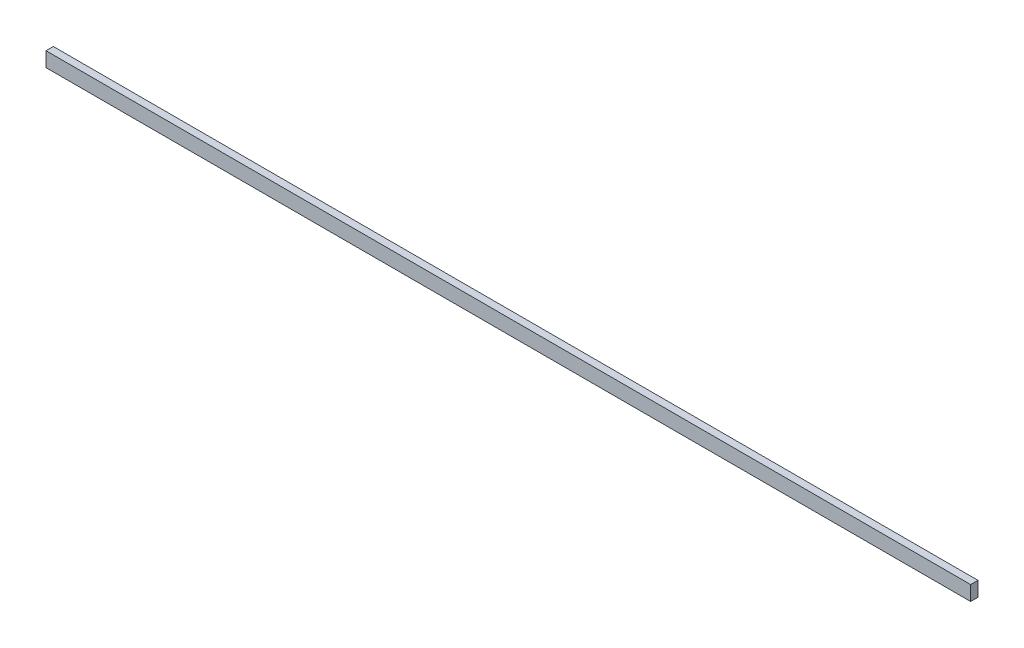
ISO-10303-21;
HEADER;
FILE_DESCRIPTION(('STEP AP214'),'2;1');
FILE_NAME('part.step','',(''),(''),'','','');
FILE_SCHEMA(('AUTOMOTIVE_DESIGN { 1 0 10303 214 1 1 1 1 }'));
ENDSEC;
DATA;
#1=APPLICATION_CONTEXT('core data for automotive mechanical design processes');
#2=APPLICATION_PROTOCOL_DEFINITION('international standard','automotive_design',2000,#1);
#3=PRODUCT_CONTEXT('',#1,'mechanical');
#4=PRODUCT('Part','Part','',(#3));
#5=PRODUCT_RELATED_PRODUCT_CATEGORY('part','',(#4));
#6=PRODUCT_DEFINITION_FORMATION('','',#4);
#7=PRODUCT_DEFINITION_CONTEXT('part definition',#1,'design');
#8=PRODUCT_DEFINITION('design','',#6,#7);
#9=PRODUCT_DEFINITION_SHAPE('','',#8);
#10=(LENGTH_UNIT() NAMED_UNIT(*) SI_UNIT(.MILLI.,.METRE.));
#11=(NAMED_UNIT(*) PLANE_ANGLE_UNIT() SI_UNIT($,.RADIAN.));
#12=(NAMED_UNIT(*) SI_UNIT($,.STERADIAN.) SOLID_ANGLE_UNIT());
#13=UNCERTAINTY_MEASURE_WITH_UNIT(LENGTH_MEASURE(1.E-05),#10,'distance_accuracy_value','');
#14=(GEOMETRIC_REPRESENTATION_CONTEXT(3) GLOBAL_UNCERTAINTY_ASSIGNED_CONTEXT((#13)) GLOBAL_UNIT_ASSIGNED_CONTEXT((#10,
#11,#12)) REPRESENTATION_CONTEXT('',''));
#15=CARTESIAN_POINT('',(0.,0.,0.));
#16=DIRECTION('',(0.,0.,1.));
#17=DIRECTION('',(1.,0.,0.));
#18=AXIS2_PLACEMENT_3D('',#15,#16,#17);
#19=CARTESIAN_POINT('',(0.,10.,0.));
#20=DIRECTION('',(1.,0.,0.));
#21=DIRECTION('',(0.,0.,-1.));
#22=AXIS2_PLACEMENT_3D('',#19,#20,#21);
#23=PLANE('',#22);
#24=DIRECTION('',(0.,0.,1.));
#25=VECTOR('',#24,1.);
#26=CARTESIAN_POINT('',(0.,0.,0.));
#27=LINE('',#26,#25);
#28=CARTESIAN_POINT('',(0.,0.,0.));
#29=VERTEX_POINT('',#28);
#30=CARTESIAN_POINT('',(0.,0.,5.));
#31=VERTEX_POINT('',#30);
#32=EDGE_CURVE('E96',#29,#31,#27,.T.);
#33=ORIENTED_EDGE('',*,*,#32,.T.);
#34=DIRECTION('',(0.,-1.,0.));
#35=VECTOR('',#34,1.);
#36=CARTESIAN_POINT('',(0.,10.,5.));
#37=LINE('',#36,#35);
#38=CARTESIAN_POINT('',(0.,10.,5.));
#39=VERTEX_POINT('',#38);
#40=EDGE_CURVE('E11',#39,#31,#37,.T.);
#41=ORIENTED_EDGE('',*,*,#40,.F.);
#42=DIRECTION('',(0.,0.,1.));
#43=VECTOR('',#42,1.);
#44=CARTESIAN_POINT('',(0.,10.,0.));
#45=LINE('',#44,#43);
#46=CARTESIAN_POINT('',(0.,10.,0.));
#47=VERTEX_POINT('',#46);
#48=EDGE_CURVE('E84',#47,#39,#45,.T.);
#49=ORIENTED_EDGE('',*,*,#48,.F.);
#50=DIRECTION('',(0.,-1.,0.));
#51=VECTOR('',#50,1.);
#52=CARTESIAN_POINT('',(0.,10.,0.));
#53=LINE('',#52,#51);
#54=EDGE_CURVE('E92',#47,#29,#53,.T.);
#55=ORIENTED_EDGE('',*,*,#54,.T.);
#56=EDGE_LOOP('',(#33,#41,#49,#55));
#57=FACE_BOUND('',#56,.T.);
#58=ADVANCED_FACE('F33',(#57),#23,.F.);
#59=CARTESIAN_POINT('',(0.,10.,5.));
#60=DIRECTION('',(0.,0.,-1.));
#61=DIRECTION('',(-1.,0.,0.));
#62=AXIS2_PLACEMENT_3D('',#59,#60,#61);
#63=PLANE('',#62);
#64=DIRECTION('',(1.,0.,0.));
#65=VECTOR('',#64,1.);
#66=CARTESIAN_POINT('',(0.,0.,5.));
#67=LINE('',#66,#65);
#68=CARTESIAN_POINT('',(630.,0.,5.));
#69=VERTEX_POINT('',#68);
#70=EDGE_CURVE('E88',#31,#69,#67,.T.);
#71=ORIENTED_EDGE('',*,*,#70,.T.);
#72=DIRECTION('',(0.,-1.,0.));
#73=VECTOR('',#72,1.);
#74=CARTESIAN_POINT('',(630.,10.,5.));
#75=LINE('',#74,#73);
#76=CARTESIAN_POINT('',(630.,10.,5.));
#77=VERTEX_POINT('',#76);
#78=EDGE_CURVE('E41',#77,#69,#75,.T.);
#79=ORIENTED_EDGE('',*,*,#78,.F.);
#80=DIRECTION('',(1.,0.,0.));
#81=VECTOR('',#80,1.);
#82=CARTESIAN_POINT('',(0.,10.,5.));
#83=LINE('',#82,#81);
#84=EDGE_CURVE('E79',#39,#77,#83,.T.);
#85=ORIENTED_EDGE('',*,*,#84,.F.);
#86=ORIENTED_EDGE('',*,*,#40,.T.);
#87=EDGE_LOOP('',(#71,#79,#85,#86));
#88=FACE_BOUND('',#87,.T.);
#89=ADVANCED_FACE('F87',(#88),#63,.F.);
#90=CARTESIAN_POINT('',(630.,10.,0.));
#91=DIRECTION('',(-1.,0.,0.));
#92=DIRECTION('',(0.,0.,1.));
#93=AXIS2_PLACEMENT_3D('',#90,#91,#92);
#94=PLANE('',#93);
#95=DIRECTION('',(0.,0.,-1.));
#96=VECTOR('',#95,1.);
#97=CARTESIAN_POINT('',(630.,0.,0.));
#98=LINE('',#97,#96);
#99=CARTESIAN_POINT('',(630.,0.,0.));
#100=VERTEX_POINT('',#99);
#101=EDGE_CURVE('E66',#69,#100,#98,.T.);
#102=ORIENTED_EDGE('',*,*,#101,.T.);
#103=DIRECTION('',(0.,-1.,0.));
#104=VECTOR('',#103,1.);
#105=CARTESIAN_POINT('',(630.,10.,0.));
#106=LINE('',#105,#104);
#107=CARTESIAN_POINT('',(630.,10.,0.));
#108=VERTEX_POINT('',#107);
#109=EDGE_CURVE('E89',#108,#100,#106,.T.);
#110=ORIENTED_EDGE('',*,*,#109,.F.);
#111=DIRECTION('',(0.,0.,-1.));
#112=VECTOR('',#111,1.);
#113=CARTESIAN_POINT('',(630.,10.,0.));
#114=LINE('',#113,#112);
#115=EDGE_CURVE('E82',#77,#108,#114,.T.);
#116=ORIENTED_EDGE('',*,*,#115,.F.);
#117=ORIENTED_EDGE('',*,*,#78,.T.);
#118=EDGE_LOOP('',(#102,#110,#116,#117));
#119=FACE_BOUND('',#118,.T.);
#120=ADVANCED_FACE('F90',(#119),#94,.F.);
#121=CARTESIAN_POINT('',(0.,10.,0.));
#122=DIRECTION('',(0.,0.,1.));
#123=DIRECTION('',(1.,0.,0.));
#124=AXIS2_PLACEMENT_3D('',#121,#122,#123);
#125=PLANE('',#124);
#126=DIRECTION('',(-1.,0.,0.));
#127=VECTOR('',#126,1.);
#128=CARTESIAN_POINT('',(0.,0.,0.));
#129=LINE('',#128,#127);
#130=EDGE_CURVE('E72',#100,#29,#129,.T.);
#131=ORIENTED_EDGE('',*,*,#130,.T.);
#132=ORIENTED_EDGE('',*,*,#54,.F.);
#133=DIRECTION('',(-1.,0.,0.));
#134=VECTOR('',#133,1.);
#135=CARTESIAN_POINT('',(0.,10.,0.));
#136=LINE('',#135,#134);
#137=EDGE_CURVE('E49',#108,#47,#136,.T.);
#138=ORIENTED_EDGE('',*,*,#137,.F.);
#139=ORIENTED_EDGE('',*,*,#109,.T.);
#140=EDGE_LOOP('',(#131,#132,#138,#139));
#141=FACE_BOUND('',#140,.T.);
#142=ADVANCED_FACE('F103',(#141),#125,.F.);
#143=CARTESIAN_POINT('',(0.,10.,0.));
#144=DIRECTION('',(0.,1.,0.));
#145=DIRECTION('',(0.,0.,1.));
#146=AXIS2_PLACEMENT_3D('',#143,#144,#145);
#147=PLANE('',#146);
#148=ORIENTED_EDGE('',*,*,#48,.T.);
#149=ORIENTED_EDGE('',*,*,#84,.T.);
#150=ORIENTED_EDGE('',*,*,#115,.T.);
#151=ORIENTED_EDGE('',*,*,#137,.T.);
#152=EDGE_LOOP('',(#148,#149,#150,#151));
#153=FACE_BOUND('',#152,.T.);
#154=ADVANCED_FACE('F80',(#153),#147,.T.);
#155=CARTESIAN_POINT('',(0.,0.,0.));
#156=DIRECTION('',(0.,1.,0.));
#157=DIRECTION('',(0.,0.,1.));
#158=AXIS2_PLACEMENT_3D('',#155,#156,#157);
#159=PLANE('',#158);
#160=ORIENTED_EDGE('',*,*,#32,.F.);
#161=ORIENTED_EDGE('',*,*,#130,.F.);
#162=ORIENTED_EDGE('',*,*,#101,.F.);
#163=ORIENTED_EDGE('',*,*,#70,.F.);
#164=EDGE_LOOP('',(#160,#161,#162,#163));
#165=FACE_BOUND('',#164,.T.);
#166=ADVANCED_FACE('F106',(#165),#159,.F.);
#167=CLOSED_SHELL('',(#58,#89,#120,#142,#154,#166));
#168=MANIFOLD_SOLID_BREP('B2',#167);
#169=ADVANCED_BREP_SHAPE_REPRESENTATION('',(#18,#168),#14);
#170=SHAPE_DEFINITION_REPRESENTATION(#9,#169);
ENDSEC;
END-ISO-10303-21;
